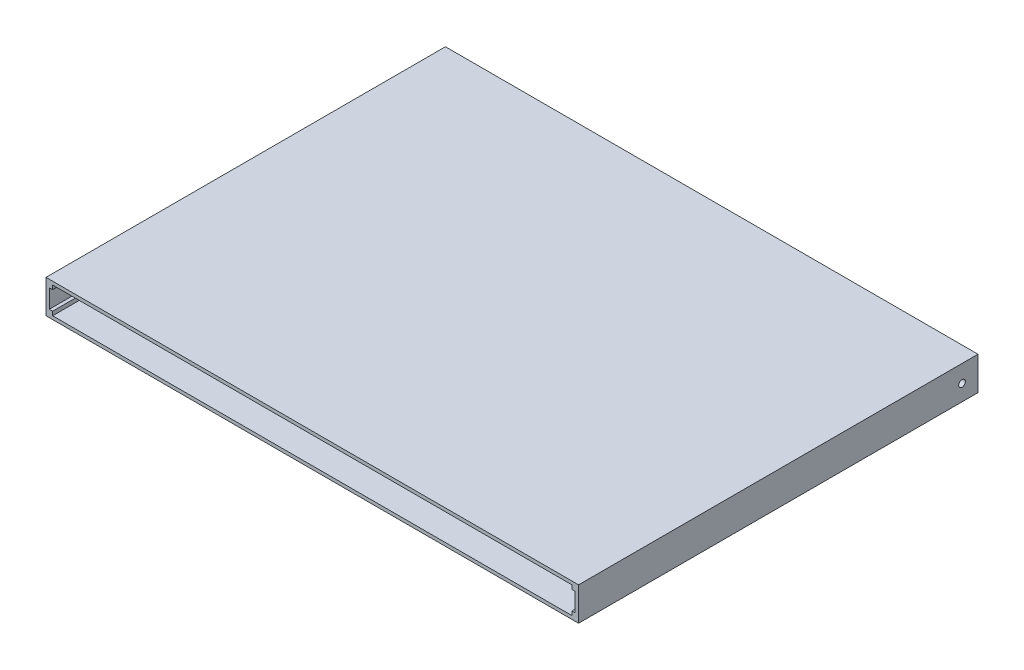
ISO-10303-21;
HEADER;
FILE_DESCRIPTION(('STEP AP214'),'2;1');
FILE_NAME('part.step','',(''),(''),'','','');
FILE_SCHEMA(('AUTOMOTIVE_DESIGN { 1 0 10303 214 1 1 1 1 }'));
ENDSEC;
DATA;
#1=APPLICATION_CONTEXT('core data for automotive mechanical design processes');
#2=APPLICATION_PROTOCOL_DEFINITION('international standard','automotive_design',2000,#1);
#3=PRODUCT_CONTEXT('',#1,'mechanical');
#4=PRODUCT('Part','Part','',(#3));
#5=PRODUCT_RELATED_PRODUCT_CATEGORY('part','',(#4));
#6=PRODUCT_DEFINITION_FORMATION('','',#4);
#7=PRODUCT_DEFINITION_CONTEXT('part definition',#1,'design');
#8=PRODUCT_DEFINITION('design','',#6,#7);
#9=PRODUCT_DEFINITION_SHAPE('','',#8);
#10=(LENGTH_UNIT() NAMED_UNIT(*) SI_UNIT(.MILLI.,.METRE.));
#11=(NAMED_UNIT(*) PLANE_ANGLE_UNIT() SI_UNIT($,.RADIAN.));
#12=(NAMED_UNIT(*) SI_UNIT($,.STERADIAN.) SOLID_ANGLE_UNIT());
#13=UNCERTAINTY_MEASURE_WITH_UNIT(LENGTH_MEASURE(1.E-05),#10,'distance_accuracy_value','');
#14=(GEOMETRIC_REPRESENTATION_CONTEXT(3) GLOBAL_UNCERTAINTY_ASSIGNED_CONTEXT((#13)) GLOBAL_UNIT_ASSIGNED_CONTEXT((#10,
#11,#12)) REPRESENTATION_CONTEXT('',''));
#15=CARTESIAN_POINT('',(0.,0.,0.));
#16=DIRECTION('',(0.,0.,1.));
#17=DIRECTION('',(1.,0.,0.));
#18=AXIS2_PLACEMENT_3D('',#15,#16,#17);
#19=CARTESIAN_POINT('',(254.,31.75,-190.5));
#20=DIRECTION('',(-1.,0.,0.));
#21=DIRECTION('',(0.,0.,1.));
#22=AXIS2_PLACEMENT_3D('',#19,#20,#21);
#23=PLANE('',#22);
#24=CARTESIAN_POINT('',(254.,15.24,-175.26));
#25=DIRECTION('',(-1.,0.,0.));
#26=DIRECTION('',(0.,0.,1.));
#27=AXIS2_PLACEMENT_3D('',#24,#25,#26);
#28=CIRCLE('',#27,3.175);
#29=CARTESIAN_POINT('',(254.,15.24,-172.085));
#30=VERTEX_POINT('',#29);
#31=EDGE_CURVE('E449',#30,#30,#28,.T.);
#32=ORIENTED_EDGE('',*,*,#31,.T.);
#33=EDGE_LOOP('',(#32));
#34=FACE_BOUND('',#33,.T.);
#35=DIRECTION('',(0.,0.,-1.));
#36=VECTOR('',#35,1.);
#37=CARTESIAN_POINT('',(254.,0.,-190.5));
#38=LINE('',#37,#36);
#39=CARTESIAN_POINT('',(254.,0.,190.5));
#40=VERTEX_POINT('',#39);
#41=CARTESIAN_POINT('',(254.,0.,-190.5));
#42=VERTEX_POINT('',#41);
#43=EDGE_CURVE('E299',#40,#42,#38,.T.);
#44=ORIENTED_EDGE('',*,*,#43,.T.);
#45=DIRECTION('',(0.,-1.,0.));
#46=VECTOR('',#45,1.);
#47=CARTESIAN_POINT('',(254.,31.75,-190.5));
#48=LINE('',#47,#46);
#49=CARTESIAN_POINT('',(254.,31.75,-190.5));
#50=VERTEX_POINT('',#49);
#51=EDGE_CURVE('E11',#50,#42,#48,.T.);
#52=ORIENTED_EDGE('',*,*,#51,.F.);
#53=DIRECTION('',(0.,0.,-1.));
#54=VECTOR('',#53,1.);
#55=CARTESIAN_POINT('',(254.,31.75,-190.5));
#56=LINE('',#55,#54);
#57=CARTESIAN_POINT('',(254.,31.75,190.5));
#58=VERTEX_POINT('',#57);
#59=EDGE_CURVE('E307',#58,#50,#56,.T.);
#60=ORIENTED_EDGE('',*,*,#59,.F.);
#61=DIRECTION('',(0.,-1.,0.));
#62=VECTOR('',#61,1.);
#63=CARTESIAN_POINT('',(254.,31.75,190.5));
#64=LINE('',#63,#62);
#65=EDGE_CURVE('E317',#58,#40,#64,.T.);
#66=ORIENTED_EDGE('',*,*,#65,.T.);
#67=EDGE_LOOP('',(#44,#52,#60,#66));
#68=FACE_BOUND('',#67,.T.);
#69=ADVANCED_FACE('F40',(#34,#68),#23,.F.);
#70=CARTESIAN_POINT('',(-254.,31.75,-190.5));
#71=DIRECTION('',(0.,0.,1.));
#72=DIRECTION('',(1.,0.,0.));
#73=AXIS2_PLACEMENT_3D('',#70,#71,#72);
#74=PLANE('',#73);
#75=DIRECTION('',(-1.,0.,0.));
#76=VECTOR('',#75,1.);
#77=CARTESIAN_POINT('',(-254.,0.,-190.5));
#78=LINE('',#77,#76);
#79=CARTESIAN_POINT('',(-254.,0.,-190.5));
#80=VERTEX_POINT('',#79);
#81=EDGE_CURVE('E320',#42,#80,#78,.T.);
#82=ORIENTED_EDGE('',*,*,#81,.T.);
#83=DIRECTION('',(0.,-1.,0.));
#84=VECTOR('',#83,1.);
#85=CARTESIAN_POINT('',(-254.,31.75,-190.5));
#86=LINE('',#85,#84);
#87=CARTESIAN_POINT('',(-254.,31.75,-190.5));
#88=VERTEX_POINT('',#87);
#89=EDGE_CURVE('E47',#88,#80,#86,.T.);
#90=ORIENTED_EDGE('',*,*,#89,.F.);
#91=DIRECTION('',(-1.,0.,0.));
#92=VECTOR('',#91,1.);
#93=CARTESIAN_POINT('',(-254.,31.75,-190.5));
#94=LINE('',#93,#92);
#95=EDGE_CURVE('E310',#50,#88,#94,.T.);
#96=ORIENTED_EDGE('',*,*,#95,.F.);
#97=ORIENTED_EDGE('',*,*,#51,.T.);
#98=EDGE_LOOP('',(#82,#90,#96,#97));
#99=FACE_BOUND('',#98,.T.);
#100=ADVANCED_FACE('F350',(#99),#74,.F.);
#101=CARTESIAN_POINT('',(-254.,31.75,-190.5));
#102=DIRECTION('',(1.,0.,0.));
#103=DIRECTION('',(0.,0.,-1.));
#104=AXIS2_PLACEMENT_3D('',#101,#102,#103);
#105=PLANE('',#104);
#106=CARTESIAN_POINT('',(-254.,15.24,-175.26));
#107=DIRECTION('',(-1.,0.,0.));
#108=DIRECTION('',(0.,0.,1.));
#109=AXIS2_PLACEMENT_3D('',#106,#107,#108);
#110=CIRCLE('',#109,3.175);
#111=CARTESIAN_POINT('',(-254.,15.24,-172.085));
#112=VERTEX_POINT('',#111);
#113=EDGE_CURVE('E448',#112,#112,#110,.T.);
#114=ORIENTED_EDGE('',*,*,#113,.F.);
#115=EDGE_LOOP('',(#114));
#116=FACE_BOUND('',#115,.T.);
#117=DIRECTION('',(0.,0.,1.));
#118=VECTOR('',#117,1.);
#119=CARTESIAN_POINT('',(-254.,0.,-190.5));
#120=LINE('',#119,#118);
#121=CARTESIAN_POINT('',(-254.,0.,190.5));
#122=VERTEX_POINT('',#121);
#123=EDGE_CURVE('E322',#80,#122,#120,.T.);
#124=ORIENTED_EDGE('',*,*,#123,.T.);
#125=DIRECTION('',(0.,-1.,0.));
#126=VECTOR('',#125,1.);
#127=CARTESIAN_POINT('',(-254.,31.75,190.5));
#128=LINE('',#127,#126);
#129=CARTESIAN_POINT('',(-254.,31.75,190.5));
#130=VERTEX_POINT('',#129);
#131=EDGE_CURVE('E327',#130,#122,#128,.T.);
#132=ORIENTED_EDGE('',*,*,#131,.F.);
#133=DIRECTION('',(0.,0.,1.));
#134=VECTOR('',#133,1.);
#135=CARTESIAN_POINT('',(-254.,31.75,-190.5));
#136=LINE('',#135,#134);
#137=EDGE_CURVE('E313',#88,#130,#136,.T.);
#138=ORIENTED_EDGE('',*,*,#137,.F.);
#139=ORIENTED_EDGE('',*,*,#89,.T.);
#140=EDGE_LOOP('',(#124,#132,#138,#139));
#141=FACE_BOUND('',#140,.T.);
#142=ADVANCED_FACE('F334',(#116,#141),#105,.F.);
#143=CARTESIAN_POINT('',(-254.,31.75,190.5));
#144=DIRECTION('',(0.,0.,-1.));
#145=DIRECTION('',(-1.,0.,0.));
#146=AXIS2_PLACEMENT_3D('',#143,#144,#145);
#147=PLANE('',#146);
#148=DIRECTION('',(-1.,0.,0.));
#149=VECTOR('',#148,1.);
#150=CARTESIAN_POINT('',(250.825,28.575,190.5));
#151=LINE('',#150,#149);
#152=CARTESIAN_POINT('',(247.65,28.575,190.5));
#153=VERTEX_POINT('',#152);
#154=CARTESIAN_POINT('',(-247.65,28.5749999999999,190.5));
#155=VERTEX_POINT('',#154);
#156=EDGE_CURVE('E280',#153,#155,#151,.T.);
#157=ORIENTED_EDGE('',*,*,#156,.F.);
#158=DIRECTION('',(0.,-1.,0.));
#159=VECTOR('',#158,1.);
#160=CARTESIAN_POINT('',(247.65,28.5749999999999,190.5));
#161=LINE('',#160,#159);
#162=CARTESIAN_POINT('',(247.65,24.7649999999999,190.5));
#163=VERTEX_POINT('',#162);
#164=EDGE_CURVE('E200',#153,#163,#161,.T.);
#165=ORIENTED_EDGE('',*,*,#164,.T.);
#166=DIRECTION('',(1.,0.,0.));
#167=VECTOR('',#166,1.);
#168=CARTESIAN_POINT('',(250.825,24.7649999999999,190.5));
#169=LINE('',#168,#167);
#170=CARTESIAN_POINT('',(250.825,24.7649999999999,190.5));
#171=VERTEX_POINT('',#170);
#172=EDGE_CURVE('E182',#163,#171,#169,.T.);
#173=ORIENTED_EDGE('',*,*,#172,.T.);
#174=DIRECTION('',(0.,1.,0.));
#175=VECTOR('',#174,1.);
#176=CARTESIAN_POINT('',(250.825,28.575,190.5));
#177=LINE('',#176,#175);
#178=CARTESIAN_POINT('',(250.825,6.98499999999995,190.5));
#179=VERTEX_POINT('',#178);
#180=EDGE_CURVE('E293',#179,#171,#177,.T.);
#181=ORIENTED_EDGE('',*,*,#180,.F.);
#182=DIRECTION('',(-1.,0.,0.));
#183=VECTOR('',#182,1.);
#184=CARTESIAN_POINT('',(250.825,6.98499999999995,190.5));
#185=LINE('',#184,#183);
#186=CARTESIAN_POINT('',(247.65,6.98499999999995,190.5));
#187=VERTEX_POINT('',#186);
#188=EDGE_CURVE('E204',#179,#187,#185,.T.);
#189=ORIENTED_EDGE('',*,*,#188,.T.);
#190=DIRECTION('',(0.,-1.,0.));
#191=VECTOR('',#190,1.);
#192=CARTESIAN_POINT('',(247.65,3.17499999999995,190.5));
#193=LINE('',#192,#191);
#194=CARTESIAN_POINT('',(247.65,3.17500000000001,190.5));
#195=VERTEX_POINT('',#194);
#196=EDGE_CURVE('E209',#187,#195,#193,.T.);
#197=ORIENTED_EDGE('',*,*,#196,.T.);
#198=DIRECTION('',(1.,0.,0.));
#199=VECTOR('',#198,1.);
#200=CARTESIAN_POINT('',(250.825,3.17500000000001,190.5));
#201=LINE('',#200,#199);
#202=CARTESIAN_POINT('',(-247.65,3.17499999999995,190.5));
#203=VERTEX_POINT('',#202);
#204=EDGE_CURVE('E291',#203,#195,#201,.T.);
#205=ORIENTED_EDGE('',*,*,#204,.F.);
#206=DIRECTION('',(0.,1.,0.));
#207=VECTOR('',#206,1.);
#208=CARTESIAN_POINT('',(-247.65,3.17499999999995,190.5));
#209=LINE('',#208,#207);
#210=CARTESIAN_POINT('',(-247.65,6.98499999999995,190.5));
#211=VERTEX_POINT('',#210);
#212=EDGE_CURVE('E225',#203,#211,#209,.T.);
#213=ORIENTED_EDGE('',*,*,#212,.T.);
#214=DIRECTION('',(-1.,0.,0.));
#215=VECTOR('',#214,1.);
#216=CARTESIAN_POINT('',(-250.825,6.98499999999995,190.5));
#217=LINE('',#216,#215);
#218=CARTESIAN_POINT('',(-250.825,6.98499999999995,190.5));
#219=VERTEX_POINT('',#218);
#220=EDGE_CURVE('E232',#211,#219,#217,.T.);
#221=ORIENTED_EDGE('',*,*,#220,.T.);
#222=DIRECTION('',(0.,-1.,0.));
#223=VECTOR('',#222,1.);
#224=CARTESIAN_POINT('',(-250.825,28.5749999999999,190.5));
#225=LINE('',#224,#223);
#226=CARTESIAN_POINT('',(-250.825,24.7649999999999,190.5));
#227=VERTEX_POINT('',#226);
#228=EDGE_CURVE('E272',#227,#219,#225,.T.);
#229=ORIENTED_EDGE('',*,*,#228,.F.);
#230=DIRECTION('',(1.,0.,0.));
#231=VECTOR('',#230,1.);
#232=CARTESIAN_POINT('',(-250.825,24.7649999999999,190.5));
#233=LINE('',#232,#231);
#234=CARTESIAN_POINT('',(-247.65,24.7649999999999,190.5));
#235=VERTEX_POINT('',#234);
#236=EDGE_CURVE('E248',#227,#235,#233,.T.);
#237=ORIENTED_EDGE('',*,*,#236,.T.);
#238=DIRECTION('',(0.,1.,0.));
#239=VECTOR('',#238,1.);
#240=CARTESIAN_POINT('',(-247.65,28.5749999999999,190.5));
#241=LINE('',#240,#239);
#242=EDGE_CURVE('E256',#235,#155,#241,.T.);
#243=ORIENTED_EDGE('',*,*,#242,.T.);
#244=EDGE_LOOP('',(#157,#165,#173,#181,#189,#197,#205,#213,#221,#229,#237,#243));
#245=FACE_BOUND('',#244,.T.);
#246=DIRECTION('',(1.,0.,0.));
#247=VECTOR('',#246,1.);
#248=CARTESIAN_POINT('',(-254.,0.,190.5));
#249=LINE('',#248,#247);
#250=EDGE_CURVE('E311',#122,#40,#249,.T.);
#251=ORIENTED_EDGE('',*,*,#250,.T.);
#252=ORIENTED_EDGE('',*,*,#65,.F.);
#253=DIRECTION('',(1.,0.,0.));
#254=VECTOR('',#253,1.);
#255=CARTESIAN_POINT('',(-254.,31.75,190.5));
#256=LINE('',#255,#254);
#257=EDGE_CURVE('E315',#130,#58,#256,.T.);
#258=ORIENTED_EDGE('',*,*,#257,.F.);
#259=ORIENTED_EDGE('',*,*,#131,.T.);
#260=EDGE_LOOP('',(#251,#252,#258,#259));
#261=FACE_BOUND('',#260,.T.);
#262=ADVANCED_FACE('F343',(#245,#261),#147,.F.);
#263=CARTESIAN_POINT('',(0.,31.75,0.));
#264=DIRECTION('',(0.,1.,0.));
#265=DIRECTION('',(0.,0.,1.));
#266=AXIS2_PLACEMENT_3D('',#263,#264,#265);
#267=PLANE('',#266);
#268=ORIENTED_EDGE('',*,*,#59,.T.);
#269=ORIENTED_EDGE('',*,*,#95,.T.);
#270=ORIENTED_EDGE('',*,*,#137,.T.);
#271=ORIENTED_EDGE('',*,*,#257,.T.);
#272=EDGE_LOOP('',(#268,#269,#270,#271));
#273=FACE_BOUND('',#272,.T.);
#274=ADVANCED_FACE('F349',(#273),#267,.T.);
#275=CARTESIAN_POINT('',(0.,0.,0.));
#276=DIRECTION('',(0.,1.,0.));
#277=DIRECTION('',(0.,0.,1.));
#278=AXIS2_PLACEMENT_3D('',#275,#276,#277);
#279=PLANE('',#278);
#280=ORIENTED_EDGE('',*,*,#43,.F.);
#281=ORIENTED_EDGE('',*,*,#250,.F.);
#282=ORIENTED_EDGE('',*,*,#123,.F.);
#283=ORIENTED_EDGE('',*,*,#81,.F.);
#284=EDGE_LOOP('',(#280,#281,#282,#283));
#285=FACE_BOUND('',#284,.T.);
#286=ADVANCED_FACE('F340',(#285),#279,.F.);
#287=CARTESIAN_POINT('',(-250.825,28.5749999999999,-152.4));
#288=DIRECTION('',(-1.,0.,0.));
#289=DIRECTION('',(0.,-1.,0.));
#290=AXIS2_PLACEMENT_3D('',#287,#288,#289);
#291=PLANE('',#290);
#292=ORIENTED_EDGE('',*,*,#228,.T.);
#293=DIRECTION('',(0.,0.,1.));
#294=VECTOR('',#293,1.);
#295=CARTESIAN_POINT('',(-250.825,6.98499999999995,154.94));
#296=LINE('',#295,#294);
#297=CARTESIAN_POINT('',(-250.825,6.98499999999995,154.94));
#298=VERTEX_POINT('',#297);
#299=EDGE_CURVE('E245',#298,#219,#296,.T.);
#300=ORIENTED_EDGE('',*,*,#299,.F.);
#301=DIRECTION('',(0.,-1.,0.));
#302=VECTOR('',#301,1.);
#303=CARTESIAN_POINT('',(-250.825,3.17499999999995,154.94));
#304=LINE('',#303,#302);
#305=CARTESIAN_POINT('',(-250.825,3.17499999999995,154.94));
#306=VERTEX_POINT('',#305);
#307=EDGE_CURVE('E229',#298,#306,#304,.T.);
#308=ORIENTED_EDGE('',*,*,#307,.T.);
#309=DIRECTION('',(0.,0.,1.));
#310=VECTOR('',#309,1.);
#311=CARTESIAN_POINT('',(-250.825,3.17499999999995,-152.4));
#312=LINE('',#311,#310);
#313=CARTESIAN_POINT('',(-250.825,3.17499999999995,-152.4));
#314=VERTEX_POINT('',#313);
#315=EDGE_CURVE('E289',#314,#306,#312,.T.);
#316=ORIENTED_EDGE('',*,*,#315,.F.);
#317=DIRECTION('',(0.,-1.,0.));
#318=VECTOR('',#317,1.);
#319=CARTESIAN_POINT('',(-250.825,28.5749999999999,-152.4));
#320=LINE('',#319,#318);
#321=CARTESIAN_POINT('',(-250.825,28.5749999999999,-152.4));
#322=VERTEX_POINT('',#321);
#323=EDGE_CURVE('E276',#322,#314,#320,.T.);
#324=ORIENTED_EDGE('',*,*,#323,.F.);
#325=DIRECTION('',(0.,0.,1.));
#326=VECTOR('',#325,1.);
#327=CARTESIAN_POINT('',(-250.825,28.5749999999999,-152.4));
#328=LINE('',#327,#326);
#329=CARTESIAN_POINT('',(-250.825,28.5749999999999,154.94));
#330=VERTEX_POINT('',#329);
#331=EDGE_CURVE('E296',#322,#330,#328,.T.);
#332=ORIENTED_EDGE('',*,*,#331,.T.);
#333=DIRECTION('',(0.,-1.,0.));
#334=VECTOR('',#333,1.);
#335=CARTESIAN_POINT('',(-250.825,28.5749999999999,154.94));
#336=LINE('',#335,#334);
#337=CARTESIAN_POINT('',(-250.825,24.7649999999999,154.94));
#338=VERTEX_POINT('',#337);
#339=EDGE_CURVE('E253',#330,#338,#336,.T.);
#340=ORIENTED_EDGE('',*,*,#339,.T.);
#341=DIRECTION('',(0.,0.,1.));
#342=VECTOR('',#341,1.);
#343=CARTESIAN_POINT('',(-250.825,24.7649999999999,154.94));
#344=LINE('',#343,#342);
#345=EDGE_CURVE('E264',#338,#227,#344,.T.);
#346=ORIENTED_EDGE('',*,*,#345,.T.);
#347=EDGE_LOOP('',(#292,#300,#308,#316,#324,#332,#340,#346));
#348=FACE_BOUND('',#347,.T.);
#349=ADVANCED_FACE('F365',(#348),#291,.F.);
#350=CARTESIAN_POINT('',(250.825,28.575,-152.4));
#351=DIRECTION('',(0.,1.,0.));
#352=DIRECTION('',(-1.,0.,0.));
#353=AXIS2_PLACEMENT_3D('',#350,#351,#352);
#354=PLANE('',#353);
#355=DIRECTION('',(-1.,0.,0.));
#356=VECTOR('',#355,1.);
#357=CARTESIAN_POINT('',(250.825,28.5749999999999,154.94));
#358=LINE('',#357,#356);
#359=CARTESIAN_POINT('',(250.825,28.575,154.94));
#360=VERTEX_POINT('',#359);
#361=CARTESIAN_POINT('',(247.65,28.575,154.94));
#362=VERTEX_POINT('',#361);
#363=EDGE_CURVE('E54',#360,#362,#358,.T.);
#364=ORIENTED_EDGE('',*,*,#363,.T.);
#365=DIRECTION('',(0.,0.,1.));
#366=VECTOR('',#365,1.);
#367=CARTESIAN_POINT('',(247.65,28.5749999999999,154.94));
#368=LINE('',#367,#366);
#369=EDGE_CURVE('E58',#362,#153,#368,.T.);
#370=ORIENTED_EDGE('',*,*,#369,.T.);
#371=ORIENTED_EDGE('',*,*,#156,.T.);
#372=DIRECTION('',(0.,0.,1.));
#373=VECTOR('',#372,1.);
#374=CARTESIAN_POINT('',(-247.65,28.5749999999999,154.94));
#375=LINE('',#374,#373);
#376=CARTESIAN_POINT('',(-247.65,28.5749999999999,154.94));
#377=VERTEX_POINT('',#376);
#378=EDGE_CURVE('E269',#377,#155,#375,.T.);
#379=ORIENTED_EDGE('',*,*,#378,.F.);
#380=DIRECTION('',(-1.,0.,0.));
#381=VECTOR('',#380,1.);
#382=CARTESIAN_POINT('',(-250.825,28.5749999999999,154.94));
#383=LINE('',#382,#381);
#384=EDGE_CURVE('E262',#377,#330,#383,.T.);
#385=ORIENTED_EDGE('',*,*,#384,.T.);
#386=ORIENTED_EDGE('',*,*,#331,.F.);
#387=DIRECTION('',(-1.,0.,0.));
#388=VECTOR('',#387,1.);
#389=CARTESIAN_POINT('',(250.825,28.575,-152.4));
#390=LINE('',#389,#388);
#391=CARTESIAN_POINT('',(250.825,28.575,-152.4));
#392=VERTEX_POINT('',#391);
#393=EDGE_CURVE('E286',#392,#322,#390,.T.);
#394=ORIENTED_EDGE('',*,*,#393,.F.);
#395=DIRECTION('',(0.,0.,1.));
#396=VECTOR('',#395,1.);
#397=CARTESIAN_POINT('',(250.825,28.575,-152.4));
#398=LINE('',#397,#396);
#399=EDGE_CURVE('E300',#392,#360,#398,.T.);
#400=ORIENTED_EDGE('',*,*,#399,.T.);
#401=EDGE_LOOP('',(#364,#370,#371,#379,#385,#386,#394,#400));
#402=FACE_BOUND('',#401,.T.);
#403=ADVANCED_FACE('F370',(#402),#354,.F.);
#404=CARTESIAN_POINT('',(250.825,28.575,-152.4));
#405=DIRECTION('',(1.,0.,0.));
#406=DIRECTION('',(0.,0.,-1.));
#407=AXIS2_PLACEMENT_3D('',#404,#405,#406);
#408=PLANE('',#407);
#409=ORIENTED_EDGE('',*,*,#180,.T.);
#410=DIRECTION('',(0.,0.,1.));
#411=VECTOR('',#410,1.);
#412=CARTESIAN_POINT('',(250.825,24.7649999999999,154.94));
#413=LINE('',#412,#411);
#414=CARTESIAN_POINT('',(250.825,24.7649999999999,154.94));
#415=VERTEX_POINT('',#414);
#416=EDGE_CURVE('E186',#415,#171,#413,.T.);
#417=ORIENTED_EDGE('',*,*,#416,.F.);
#418=DIRECTION('',(0.,1.,0.));
#419=VECTOR('',#418,1.);
#420=CARTESIAN_POINT('',(250.825,28.5749999999999,154.94));
#421=LINE('',#420,#419);
#422=EDGE_CURVE('E195',#415,#360,#421,.T.);
#423=ORIENTED_EDGE('',*,*,#422,.T.);
#424=ORIENTED_EDGE('',*,*,#399,.F.);
#425=DIRECTION('',(0.,1.,0.));
#426=VECTOR('',#425,1.);
#427=CARTESIAN_POINT('',(250.825,28.575,-152.4));
#428=LINE('',#427,#426);
#429=CARTESIAN_POINT('',(250.825,3.17500000000001,-152.4));
#430=VERTEX_POINT('',#429);
#431=EDGE_CURVE('E283',#430,#392,#428,.T.);
#432=ORIENTED_EDGE('',*,*,#431,.F.);
#433=DIRECTION('',(0.,0.,1.));
#434=VECTOR('',#433,1.);
#435=CARTESIAN_POINT('',(250.825,3.17500000000001,-152.4));
#436=LINE('',#435,#434);
#437=CARTESIAN_POINT('',(250.825,3.17500000000001,154.94));
#438=VERTEX_POINT('',#437);
#439=EDGE_CURVE('E302',#430,#438,#436,.T.);
#440=ORIENTED_EDGE('',*,*,#439,.T.);
#441=DIRECTION('',(0.,1.,0.));
#442=VECTOR('',#441,1.);
#443=CARTESIAN_POINT('',(250.825,3.17499999999995,154.94));
#444=LINE('',#443,#442);
#445=CARTESIAN_POINT('',(250.825,6.98499999999995,154.94));
#446=VERTEX_POINT('',#445);
#447=EDGE_CURVE('E206',#438,#446,#444,.T.);
#448=ORIENTED_EDGE('',*,*,#447,.T.);
#449=DIRECTION('',(0.,0.,1.));
#450=VECTOR('',#449,1.);
#451=CARTESIAN_POINT('',(250.825,6.98499999999995,154.94));
#452=LINE('',#451,#450);
#453=EDGE_CURVE('E217',#446,#179,#452,.T.);
#454=ORIENTED_EDGE('',*,*,#453,.T.);
#455=EDGE_LOOP('',(#409,#417,#423,#424,#432,#440,#448,#454));
#456=FACE_BOUND('',#455,.T.);
#457=ADVANCED_FACE('F376',(#456),#408,.F.);
#458=CARTESIAN_POINT('',(250.825,3.17500000000001,-152.4));
#459=DIRECTION('',(0.,-1.,0.));
#460=DIRECTION('',(1.,0.,0.));
#461=AXIS2_PLACEMENT_3D('',#458,#459,#460);
#462=PLANE('',#461);
#463=ORIENTED_EDGE('',*,*,#204,.T.);
#464=DIRECTION('',(0.,0.,1.));
#465=VECTOR('',#464,1.);
#466=CARTESIAN_POINT('',(247.65,3.17499999999995,154.94));
#467=LINE('',#466,#465);
#468=CARTESIAN_POINT('',(247.65,3.17500000000001,154.94));
#469=VERTEX_POINT('',#468);
#470=EDGE_CURVE('E222',#469,#195,#467,.T.);
#471=ORIENTED_EDGE('',*,*,#470,.F.);
#472=DIRECTION('',(1.,0.,0.));
#473=VECTOR('',#472,1.);
#474=CARTESIAN_POINT('',(250.825,3.17499999999995,154.94));
#475=LINE('',#474,#473);
#476=EDGE_CURVE('E215',#469,#438,#475,.T.);
#477=ORIENTED_EDGE('',*,*,#476,.T.);
#478=ORIENTED_EDGE('',*,*,#439,.F.);
#479=DIRECTION('',(1.,0.,0.));
#480=VECTOR('',#479,1.);
#481=CARTESIAN_POINT('',(250.825,3.17500000000001,-152.4));
#482=LINE('',#481,#480);
#483=EDGE_CURVE('E279',#314,#430,#482,.T.);
#484=ORIENTED_EDGE('',*,*,#483,.F.);
#485=ORIENTED_EDGE('',*,*,#315,.T.);
#486=DIRECTION('',(1.,0.,0.));
#487=VECTOR('',#486,1.);
#488=CARTESIAN_POINT('',(-250.825,3.17499999999995,154.94));
#489=LINE('',#488,#487);
#490=CARTESIAN_POINT('',(-247.65,3.17499999999995,154.94));
#491=VERTEX_POINT('',#490);
#492=EDGE_CURVE('E231',#306,#491,#489,.T.);
#493=ORIENTED_EDGE('',*,*,#492,.T.);
#494=DIRECTION('',(0.,0.,1.));
#495=VECTOR('',#494,1.);
#496=CARTESIAN_POINT('',(-247.65,3.17499999999995,154.94));
#497=LINE('',#496,#495);
#498=EDGE_CURVE('E240',#491,#203,#497,.T.);
#499=ORIENTED_EDGE('',*,*,#498,.T.);
#500=EDGE_LOOP('',(#463,#471,#477,#478,#484,#485,#493,#499));
#501=FACE_BOUND('',#500,.T.);
#502=ADVANCED_FACE('F372',(#501),#462,.F.);
#503=CARTESIAN_POINT('',(0.,0.,-152.4));
#504=DIRECTION('',(0.,0.,-1.));
#505=DIRECTION('',(-1.,0.,0.));
#506=AXIS2_PLACEMENT_3D('',#503,#504,#505);
#507=PLANE('',#506);
#508=ORIENTED_EDGE('',*,*,#323,.T.);
#509=ORIENTED_EDGE('',*,*,#483,.T.);
#510=ORIENTED_EDGE('',*,*,#431,.T.);
#511=ORIENTED_EDGE('',*,*,#393,.T.);
#512=EDGE_LOOP('',(#508,#509,#510,#511));
#513=FACE_BOUND('',#512,.T.);
#514=ADVANCED_FACE('F375',(#513),#507,.F.);
#515=CARTESIAN_POINT('',(-247.65,28.5749999999999,154.94));
#516=DIRECTION('',(1.,0.,0.));
#517=DIRECTION('',(0.,0.,-1.));
#518=AXIS2_PLACEMENT_3D('',#515,#516,#517);
#519=PLANE('',#518);
#520=ORIENTED_EDGE('',*,*,#242,.F.);
#521=DIRECTION('',(0.,0.,1.));
#522=VECTOR('',#521,1.);
#523=CARTESIAN_POINT('',(-247.65,24.7649999999999,154.94));
#524=LINE('',#523,#522);
#525=CARTESIAN_POINT('',(-247.65,24.7649999999999,154.94));
#526=VERTEX_POINT('',#525);
#527=EDGE_CURVE('E273',#526,#235,#524,.T.);
#528=ORIENTED_EDGE('',*,*,#527,.F.);
#529=DIRECTION('',(0.,1.,0.));
#530=VECTOR('',#529,1.);
#531=CARTESIAN_POINT('',(-247.65,28.5749999999999,154.94));
#532=LINE('',#531,#530);
#533=EDGE_CURVE('E259',#526,#377,#532,.T.);
#534=ORIENTED_EDGE('',*,*,#533,.T.);
#535=ORIENTED_EDGE('',*,*,#378,.T.);
#536=EDGE_LOOP('',(#520,#528,#534,#535));
#537=FACE_BOUND('',#536,.T.);
#538=ADVANCED_FACE('F385',(#537),#519,.T.);
#539=CARTESIAN_POINT('',(-250.825,24.7649999999999,154.94));
#540=DIRECTION('',(0.,-1.,0.));
#541=DIRECTION('',(0.,0.,-1.));
#542=AXIS2_PLACEMENT_3D('',#539,#540,#541);
#543=PLANE('',#542);
#544=ORIENTED_EDGE('',*,*,#236,.F.);
#545=ORIENTED_EDGE('',*,*,#345,.F.);
#546=DIRECTION('',(1.,0.,0.));
#547=VECTOR('',#546,1.);
#548=CARTESIAN_POINT('',(-250.825,24.7649999999999,154.94));
#549=LINE('',#548,#547);
#550=EDGE_CURVE('E255',#338,#526,#549,.T.);
#551=ORIENTED_EDGE('',*,*,#550,.T.);
#552=ORIENTED_EDGE('',*,*,#527,.T.);
#553=EDGE_LOOP('',(#544,#545,#551,#552));
#554=FACE_BOUND('',#553,.T.);
#555=ADVANCED_FACE('F387',(#554),#543,.T.);
#556=CARTESIAN_POINT('',(0.,0.,154.94));
#557=DIRECTION('',(0.,0.,1.));
#558=DIRECTION('',(1.,0.,0.));
#559=AXIS2_PLACEMENT_3D('',#556,#557,#558);
#560=PLANE('',#559);
#561=ORIENTED_EDGE('',*,*,#339,.F.);
#562=ORIENTED_EDGE('',*,*,#384,.F.);
#563=ORIENTED_EDGE('',*,*,#533,.F.);
#564=ORIENTED_EDGE('',*,*,#550,.F.);
#565=EDGE_LOOP('',(#561,#562,#563,#564));
#566=FACE_BOUND('',#565,.T.);
#567=ADVANCED_FACE('F390',(#566),#560,.F.);
#568=CARTESIAN_POINT('',(-250.825,6.98499999999995,154.94));
#569=DIRECTION('',(0.,1.,0.));
#570=DIRECTION('',(0.,0.,1.));
#571=AXIS2_PLACEMENT_3D('',#568,#569,#570);
#572=PLANE('',#571);
#573=ORIENTED_EDGE('',*,*,#220,.F.);
#574=DIRECTION('',(0.,0.,1.));
#575=VECTOR('',#574,1.);
#576=CARTESIAN_POINT('',(-247.65,6.98499999999995,154.94));
#577=LINE('',#576,#575);
#578=CARTESIAN_POINT('',(-247.65,6.98499999999995,154.94));
#579=VERTEX_POINT('',#578);
#580=EDGE_CURVE('E249',#579,#211,#577,.T.);
#581=ORIENTED_EDGE('',*,*,#580,.F.);
#582=DIRECTION('',(-1.,0.,0.));
#583=VECTOR('',#582,1.);
#584=CARTESIAN_POINT('',(-250.825,6.98499999999995,154.94));
#585=LINE('',#584,#583);
#586=EDGE_CURVE('E237',#579,#298,#585,.T.);
#587=ORIENTED_EDGE('',*,*,#586,.T.);
#588=ORIENTED_EDGE('',*,*,#299,.T.);
#589=EDGE_LOOP('',(#573,#581,#587,#588));
#590=FACE_BOUND('',#589,.T.);
#591=ADVANCED_FACE('F397',(#590),#572,.T.);
#592=CARTESIAN_POINT('',(-247.65,3.17499999999995,154.94));
#593=DIRECTION('',(1.,0.,0.));
#594=DIRECTION('',(0.,0.,-1.));
#595=AXIS2_PLACEMENT_3D('',#592,#593,#594);
#596=PLANE('',#595);
#597=ORIENTED_EDGE('',*,*,#212,.F.);
#598=ORIENTED_EDGE('',*,*,#498,.F.);
#599=DIRECTION('',(0.,1.,0.));
#600=VECTOR('',#599,1.);
#601=CARTESIAN_POINT('',(-247.65,3.17499999999995,154.94));
#602=LINE('',#601,#600);
#603=EDGE_CURVE('E234',#491,#579,#602,.T.);
#604=ORIENTED_EDGE('',*,*,#603,.T.);
#605=ORIENTED_EDGE('',*,*,#580,.T.);
#606=EDGE_LOOP('',(#597,#598,#604,#605));
#607=FACE_BOUND('',#606,.T.);
#608=ADVANCED_FACE('F399',(#607),#596,.T.);
#609=CARTESIAN_POINT('',(0.,0.,154.94));
#610=DIRECTION('',(0.,0.,-1.));
#611=DIRECTION('',(-1.,0.,0.));
#612=AXIS2_PLACEMENT_3D('',#609,#610,#611);
#613=PLANE('',#612);
#614=ORIENTED_EDGE('',*,*,#307,.F.);
#615=ORIENTED_EDGE('',*,*,#586,.F.);
#616=ORIENTED_EDGE('',*,*,#603,.F.);
#617=ORIENTED_EDGE('',*,*,#492,.F.);
#618=EDGE_LOOP('',(#614,#615,#616,#617));
#619=FACE_BOUND('',#618,.T.);
#620=ADVANCED_FACE('F402',(#619),#613,.T.);
#621=CARTESIAN_POINT('',(247.65,3.17499999999995,154.94));
#622=DIRECTION('',(-1.,0.,0.));
#623=DIRECTION('',(0.,0.,1.));
#624=AXIS2_PLACEMENT_3D('',#621,#622,#623);
#625=PLANE('',#624);
#626=ORIENTED_EDGE('',*,*,#196,.F.);
#627=DIRECTION('',(0.,0.,1.));
#628=VECTOR('',#627,1.);
#629=CARTESIAN_POINT('',(247.65,6.98499999999995,154.94));
#630=LINE('',#629,#628);
#631=CARTESIAN_POINT('',(247.65,6.98499999999995,154.94));
#632=VERTEX_POINT('',#631);
#633=EDGE_CURVE('E226',#632,#187,#630,.T.);
#634=ORIENTED_EDGE('',*,*,#633,.F.);
#635=DIRECTION('',(0.,-1.,0.));
#636=VECTOR('',#635,1.);
#637=CARTESIAN_POINT('',(247.65,3.17499999999995,154.94));
#638=LINE('',#637,#636);
#639=EDGE_CURVE('E212',#632,#469,#638,.T.);
#640=ORIENTED_EDGE('',*,*,#639,.T.);
#641=ORIENTED_EDGE('',*,*,#470,.T.);
#642=EDGE_LOOP('',(#626,#634,#640,#641));
#643=FACE_BOUND('',#642,.T.);
#644=ADVANCED_FACE('F409',(#643),#625,.T.);
#645=CARTESIAN_POINT('',(250.825,6.98499999999995,154.94));
#646=DIRECTION('',(0.,1.,0.));
#647=DIRECTION('',(0.,0.,1.));
#648=AXIS2_PLACEMENT_3D('',#645,#646,#647);
#649=PLANE('',#648);
#650=ORIENTED_EDGE('',*,*,#188,.F.);
#651=ORIENTED_EDGE('',*,*,#453,.F.);
#652=DIRECTION('',(-1.,0.,0.));
#653=VECTOR('',#652,1.);
#654=CARTESIAN_POINT('',(250.825,6.98499999999995,154.94));
#655=LINE('',#654,#653);
#656=EDGE_CURVE('E208',#446,#632,#655,.T.);
#657=ORIENTED_EDGE('',*,*,#656,.T.);
#658=ORIENTED_EDGE('',*,*,#633,.T.);
#659=EDGE_LOOP('',(#650,#651,#657,#658));
#660=FACE_BOUND('',#659,.T.);
#661=ADVANCED_FACE('F411',(#660),#649,.T.);
#662=CARTESIAN_POINT('',(0.,0.,154.94));
#663=DIRECTION('',(0.,0.,1.));
#664=DIRECTION('',(1.,0.,0.));
#665=AXIS2_PLACEMENT_3D('',#662,#663,#664);
#666=PLANE('',#665);
#667=ORIENTED_EDGE('',*,*,#447,.F.);
#668=ORIENTED_EDGE('',*,*,#476,.F.);
#669=ORIENTED_EDGE('',*,*,#639,.F.);
#670=ORIENTED_EDGE('',*,*,#656,.F.);
#671=EDGE_LOOP('',(#667,#668,#669,#670));
#672=FACE_BOUND('',#671,.T.);
#673=ADVANCED_FACE('F414',(#672),#666,.F.);
#674=CARTESIAN_POINT('',(250.825,24.7649999999999,154.94));
#675=DIRECTION('',(0.,-1.,0.));
#676=DIRECTION('',(0.,0.,-1.));
#677=AXIS2_PLACEMENT_3D('',#674,#675,#676);
#678=PLANE('',#677);
#679=ORIENTED_EDGE('',*,*,#172,.F.);
#680=DIRECTION('',(0.,0.,1.));
#681=VECTOR('',#680,1.);
#682=CARTESIAN_POINT('',(247.65,24.7649999999999,154.94));
#683=LINE('',#682,#681);
#684=CARTESIAN_POINT('',(247.65,24.7649999999999,154.94));
#685=VERTEX_POINT('',#684);
#686=EDGE_CURVE('E175',#685,#163,#683,.T.);
#687=ORIENTED_EDGE('',*,*,#686,.F.);
#688=DIRECTION('',(1.,0.,0.));
#689=VECTOR('',#688,1.);
#690=CARTESIAN_POINT('',(250.825,24.7649999999999,154.94));
#691=LINE('',#690,#689);
#692=EDGE_CURVE('E180',#685,#415,#691,.T.);
#693=ORIENTED_EDGE('',*,*,#692,.T.);
#694=ORIENTED_EDGE('',*,*,#416,.T.);
#695=EDGE_LOOP('',(#679,#687,#693,#694));
#696=FACE_BOUND('',#695,.T.);
#697=ADVANCED_FACE('F177',(#696),#678,.T.);
#698=CARTESIAN_POINT('',(247.65,28.5749999999999,154.94));
#699=DIRECTION('',(-1.,0.,0.));
#700=DIRECTION('',(0.,0.,1.));
#701=AXIS2_PLACEMENT_3D('',#698,#699,#700);
#702=PLANE('',#701);
#703=ORIENTED_EDGE('',*,*,#164,.F.);
#704=ORIENTED_EDGE('',*,*,#369,.F.);
#705=DIRECTION('',(0.,-1.,0.));
#706=VECTOR('',#705,1.);
#707=CARTESIAN_POINT('',(247.65,28.5749999999999,154.94));
#708=LINE('',#707,#706);
#709=EDGE_CURVE('E189',#362,#685,#708,.T.);
#710=ORIENTED_EDGE('',*,*,#709,.T.);
#711=ORIENTED_EDGE('',*,*,#686,.T.);
#712=EDGE_LOOP('',(#703,#704,#710,#711));
#713=FACE_BOUND('',#712,.T.);
#714=ADVANCED_FACE('F190',(#713),#702,.T.);
#715=CARTESIAN_POINT('',(0.,0.,154.94));
#716=DIRECTION('',(0.,0.,-1.));
#717=DIRECTION('',(-1.,0.,0.));
#718=AXIS2_PLACEMENT_3D('',#715,#716,#717);
#719=PLANE('',#718);
#720=ORIENTED_EDGE('',*,*,#422,.F.);
#721=ORIENTED_EDGE('',*,*,#692,.F.);
#722=ORIENTED_EDGE('',*,*,#709,.F.);
#723=ORIENTED_EDGE('',*,*,#363,.F.);
#724=EDGE_LOOP('',(#720,#721,#722,#723));
#725=FACE_BOUND('',#724,.T.);
#726=ADVANCED_FACE('F194',(#725),#719,.T.);
#727=CARTESIAN_POINT('',(-228.6,15.24,-175.26));
#728=DIRECTION('',(-1.,0.,0.));
#729=DIRECTION('',(0.,0.,1.));
#730=AXIS2_PLACEMENT_3D('',#727,#728,#729);
#731=CYLINDRICAL_SURFACE('',#730,3.175);
#732=CARTESIAN_POINT('',(-228.6,15.24,-175.26));
#733=DIRECTION('',(-1.,0.,0.));
#734=DIRECTION('',(0.,0.,1.));
#735=AXIS2_PLACEMENT_3D('',#732,#733,#734);
#736=CIRCLE('',#735,3.175);
#737=CARTESIAN_POINT('',(-228.6,15.24,-172.085));
#738=VERTEX_POINT('',#737);
#739=EDGE_CURVE('E202',#738,#738,#736,.T.);
#740=ORIENTED_EDGE('',*,*,#739,.F.);
#741=EDGE_LOOP('',(#740));
#742=FACE_BOUND('',#741,.T.);
#743=ORIENTED_EDGE('',*,*,#113,.T.);
#744=EDGE_LOOP('',(#743));
#745=FACE_BOUND('',#744,.T.);
#746=ADVANCED_FACE('F428',(#742,#745),#731,.F.);
#747=CARTESIAN_POINT('',(-228.6,15.24,-175.26));
#748=DIRECTION('',(-1.,0.,0.));
#749=DIRECTION('',(0.,0.,1.));
#750=AXIS2_PLACEMENT_3D('',#747,#748,#749);
#751=PLANE('',#750);
#752=ORIENTED_EDGE('',*,*,#739,.T.);
#753=EDGE_LOOP('',(#752));
#754=FACE_BOUND('',#753,.T.);
#755=ADVANCED_FACE('F431',(#754),#751,.T.);
#756=CARTESIAN_POINT('',(228.6,15.24,-175.26));
#757=DIRECTION('',(1.,0.,0.));
#758=DIRECTION('',(0.,0.,-1.));
#759=AXIS2_PLACEMENT_3D('',#756,#757,#758);
#760=CYLINDRICAL_SURFACE('',#759,3.175);
#761=CARTESIAN_POINT('',(228.6,15.24,-175.26));
#762=DIRECTION('',(-1.,0.,0.));
#763=DIRECTION('',(0.,0.,1.));
#764=AXIS2_PLACEMENT_3D('',#761,#762,#763);
#765=CIRCLE('',#764,3.175);
#766=CARTESIAN_POINT('',(228.6,15.24,-172.085));
#767=VERTEX_POINT('',#766);
#768=EDGE_CURVE('E447',#767,#767,#765,.T.);
#769=ORIENTED_EDGE('',*,*,#768,.T.);
#770=EDGE_LOOP('',(#769));
#771=FACE_BOUND('',#770,.T.);
#772=ORIENTED_EDGE('',*,*,#31,.F.);
#773=EDGE_LOOP('',(#772));
#774=FACE_BOUND('',#773,.T.);
#775=ADVANCED_FACE('F435',(#771,#774),#760,.F.);
#776=CARTESIAN_POINT('',(228.6,15.24,-175.26));
#777=DIRECTION('',(-1.,0.,0.));
#778=DIRECTION('',(0.,0.,1.));
#779=AXIS2_PLACEMENT_3D('',#776,#777,#778);
#780=PLANE('',#779);
#781=ORIENTED_EDGE('',*,*,#768,.F.);
#782=EDGE_LOOP('',(#781));
#783=FACE_BOUND('',#782,.T.);
#784=ADVANCED_FACE('F439',(#783),#780,.F.);
#785=CLOSED_SHELL('',(#69,#100,#142,#262,#274,#286,#349,#403,#457,#502,#514,#538,#555,#567,#591,
#608,#620,#644,#661,#673,#697,#714,#726,#746,#755,#775,#784));
#786=MANIFOLD_SOLID_BREP('B2',#785);
#787=ADVANCED_BREP_SHAPE_REPRESENTATION('',(#18,#786),#14);
#788=SHAPE_DEFINITION_REPRESENTATION(#9,#787);
ENDSEC;
END-ISO-10303-21;
